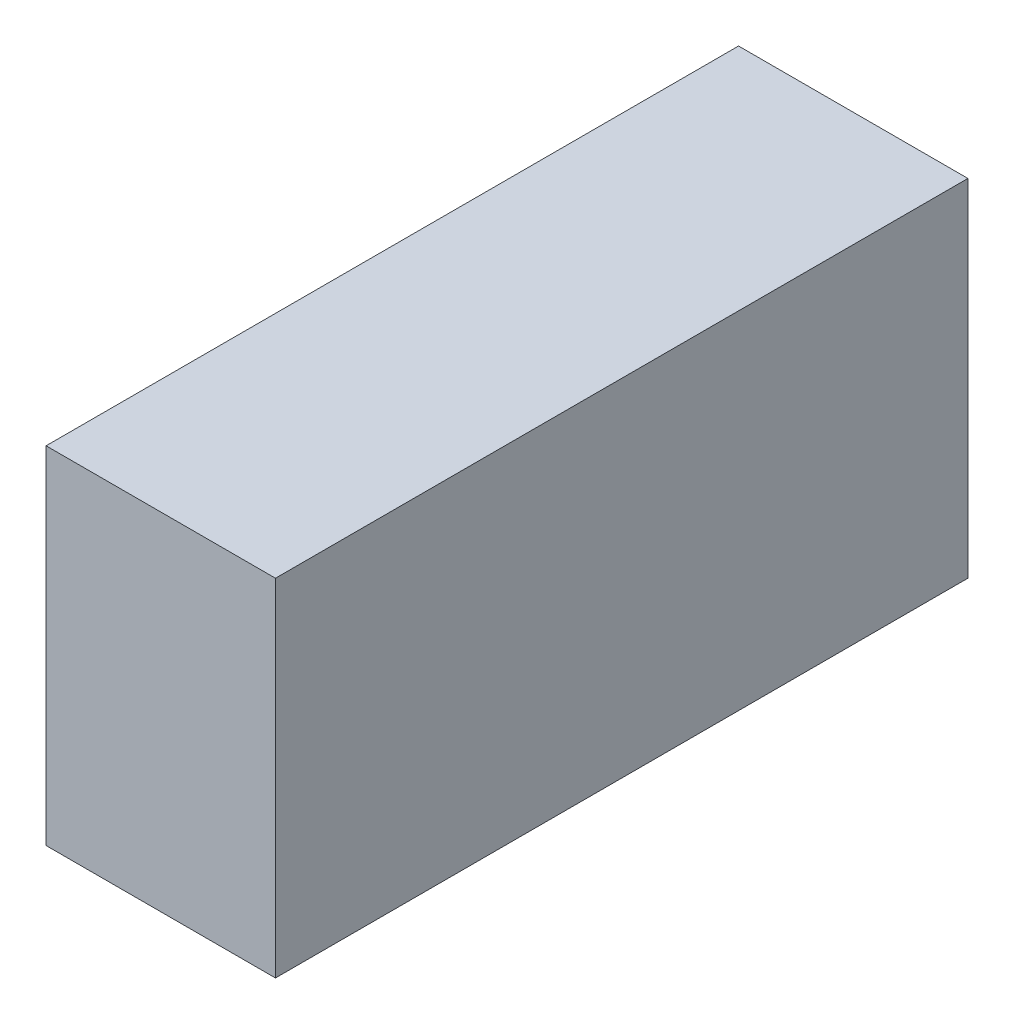
ISO-10303-21;
HEADER;
FILE_DESCRIPTION(('STEP AP214'),'2;1');
FILE_NAME('part.step','',(''),(''),'','','');
FILE_SCHEMA(('AUTOMOTIVE_DESIGN { 1 0 10303 214 1 1 1 1 }'));
ENDSEC;
DATA;
#1=APPLICATION_CONTEXT('core data for automotive mechanical design processes');
#2=APPLICATION_PROTOCOL_DEFINITION('international standard','automotive_design',2000,#1);
#3=PRODUCT_CONTEXT('',#1,'mechanical');
#4=PRODUCT('Part','Part','',(#3));
#5=PRODUCT_RELATED_PRODUCT_CATEGORY('part','',(#4));
#6=PRODUCT_DEFINITION_FORMATION('','',#4);
#7=PRODUCT_DEFINITION_CONTEXT('part definition',#1,'design');
#8=PRODUCT_DEFINITION('design','',#6,#7);
#9=PRODUCT_DEFINITION_SHAPE('','',#8);
#10=(LENGTH_UNIT() NAMED_UNIT(*) SI_UNIT(.MILLI.,.METRE.));
#11=(NAMED_UNIT(*) PLANE_ANGLE_UNIT() SI_UNIT($,.RADIAN.));
#12=(NAMED_UNIT(*) SI_UNIT($,.STERADIAN.) SOLID_ANGLE_UNIT());
#13=UNCERTAINTY_MEASURE_WITH_UNIT(LENGTH_MEASURE(1.E-05),#10,'distance_accuracy_value','');
#14=(GEOMETRIC_REPRESENTATION_CONTEXT(3) GLOBAL_UNCERTAINTY_ASSIGNED_CONTEXT((#13)) GLOBAL_UNIT_ASSIGNED_CONTEXT((#10,
#11,#12)) REPRESENTATION_CONTEXT('',''));
#15=CARTESIAN_POINT('',(0.,0.,0.));
#16=DIRECTION('',(0.,0.,1.));
#17=DIRECTION('',(1.,0.,0.));
#18=AXIS2_PLACEMENT_3D('',#15,#16,#17);
#19=CARTESIAN_POINT('',(0.26500074,-0.3999992,0.));
#20=DIRECTION('',(-1.,0.,0.));
#21=DIRECTION('',(0.,1.,0.));
#22=AXIS2_PLACEMENT_3D('',#19,#20,#21);
#23=PLANE('',#22);
#24=DIRECTION('',(0.,1.,0.));
#25=VECTOR('',#24,1.);
#26=CARTESIAN_POINT('',(0.26500074,-0.3999992,0.));
#27=LINE('',#26,#25);
#28=CARTESIAN_POINT('',(0.26500074,-0.3999992,0.));
#29=VERTEX_POINT('',#28);
#30=CARTESIAN_POINT('',(0.26500074,0.3999992,0.));
#31=VERTEX_POINT('',#30);
#32=EDGE_CURVE('E11',#29,#31,#27,.T.);
#33=ORIENTED_EDGE('',*,*,#32,.T.);
#34=DIRECTION('',(0.,0.,1.));
#35=VECTOR('',#34,1.);
#36=CARTESIAN_POINT('',(0.26500074,0.3999992,0.));
#37=LINE('',#36,#35);
#38=CARTESIAN_POINT('',(0.26500074,0.3999992,1.59999934));
#39=VERTEX_POINT('',#38);
#40=EDGE_CURVE('E24',#31,#39,#37,.T.);
#41=ORIENTED_EDGE('',*,*,#40,.T.);
#42=DIRECTION('',(0.,1.,0.));
#43=VECTOR('',#42,1.);
#44=CARTESIAN_POINT('',(0.26500074,-0.3999992,1.59999934));
#45=LINE('',#44,#43);
#46=CARTESIAN_POINT('',(0.26500074,-0.3999992,1.59999934));
#47=VERTEX_POINT('',#46);
#48=EDGE_CURVE('E87',#47,#39,#45,.T.);
#49=ORIENTED_EDGE('',*,*,#48,.F.);
#50=DIRECTION('',(0.,0.,1.));
#51=VECTOR('',#50,1.);
#52=CARTESIAN_POINT('',(0.26500074,-0.3999992,0.));
#53=LINE('',#52,#51);
#54=EDGE_CURVE('E36',#29,#47,#53,.T.);
#55=ORIENTED_EDGE('',*,*,#54,.F.);
#56=EDGE_LOOP('',(#33,#41,#49,#55));
#57=FACE_BOUND('',#56,.T.);
#58=ADVANCED_FACE('F17',(#57),#23,.F.);
#59=CARTESIAN_POINT('',(0.26500074,0.3999992,0.));
#60=DIRECTION('',(0.,-1.,0.));
#61=DIRECTION('',(-1.,0.,0.));
#62=AXIS2_PLACEMENT_3D('',#59,#60,#61);
#63=PLANE('',#62);
#64=DIRECTION('',(-1.,0.,0.));
#65=VECTOR('',#64,1.);
#66=CARTESIAN_POINT('',(0.26500074,0.3999992,0.));
#67=LINE('',#66,#65);
#68=CARTESIAN_POINT('',(-0.26500074,0.3999992,0.));
#69=VERTEX_POINT('',#68);
#70=EDGE_CURVE('E84',#31,#69,#67,.T.);
#71=ORIENTED_EDGE('',*,*,#70,.T.);
#72=DIRECTION('',(0.,0.,1.));
#73=VECTOR('',#72,1.);
#74=CARTESIAN_POINT('',(-0.26500074,0.3999992,0.));
#75=LINE('',#74,#73);
#76=CARTESIAN_POINT('',(-0.26500074,0.3999992,1.59999934));
#77=VERTEX_POINT('',#76);
#78=EDGE_CURVE('E82',#69,#77,#75,.T.);
#79=ORIENTED_EDGE('',*,*,#78,.T.);
#80=DIRECTION('',(-1.,0.,0.));
#81=VECTOR('',#80,1.);
#82=CARTESIAN_POINT('',(0.26500074,0.3999992,1.59999934));
#83=LINE('',#82,#81);
#84=EDGE_CURVE('E62',#39,#77,#83,.T.);
#85=ORIENTED_EDGE('',*,*,#84,.F.);
#86=ORIENTED_EDGE('',*,*,#40,.F.);
#87=EDGE_LOOP('',(#71,#79,#85,#86));
#88=FACE_BOUND('',#87,.T.);
#89=ADVANCED_FACE('F89',(#88),#63,.F.);
#90=CARTESIAN_POINT('',(-0.26500074,0.3999992,0.));
#91=DIRECTION('',(1.,0.,0.));
#92=DIRECTION('',(0.,-1.,0.));
#93=AXIS2_PLACEMENT_3D('',#90,#91,#92);
#94=PLANE('',#93);
#95=DIRECTION('',(0.,-1.,0.));
#96=VECTOR('',#95,1.);
#97=CARTESIAN_POINT('',(-0.26500074,0.3999992,0.));
#98=LINE('',#97,#96);
#99=CARTESIAN_POINT('',(-0.26500074,-0.3999992,0.));
#100=VERTEX_POINT('',#99);
#101=EDGE_CURVE('E71',#69,#100,#98,.T.);
#102=ORIENTED_EDGE('',*,*,#101,.T.);
#103=DIRECTION('',(0.,0.,1.));
#104=VECTOR('',#103,1.);
#105=CARTESIAN_POINT('',(-0.26500074,-0.3999992,0.));
#106=LINE('',#105,#104);
#107=CARTESIAN_POINT('',(-0.26500074,-0.3999992,1.59999934));
#108=VERTEX_POINT('',#107);
#109=EDGE_CURVE('E65',#100,#108,#106,.T.);
#110=ORIENTED_EDGE('',*,*,#109,.T.);
#111=DIRECTION('',(0.,-1.,0.));
#112=VECTOR('',#111,1.);
#113=CARTESIAN_POINT('',(-0.26500074,0.3999992,1.59999934));
#114=LINE('',#113,#112);
#115=EDGE_CURVE('E57',#77,#108,#114,.T.);
#116=ORIENTED_EDGE('',*,*,#115,.F.);
#117=ORIENTED_EDGE('',*,*,#78,.F.);
#118=EDGE_LOOP('',(#102,#110,#116,#117));
#119=FACE_BOUND('',#118,.T.);
#120=ADVANCED_FACE('F69',(#119),#94,.F.);
#121=CARTESIAN_POINT('',(-0.26500074,-0.3999992,0.));
#122=DIRECTION('',(0.,1.,0.));
#123=DIRECTION('',(1.,0.,0.));
#124=AXIS2_PLACEMENT_3D('',#121,#122,#123);
#125=PLANE('',#124);
#126=DIRECTION('',(1.,0.,0.));
#127=VECTOR('',#126,1.);
#128=CARTESIAN_POINT('',(-0.26500074,-0.3999992,0.));
#129=LINE('',#128,#127);
#130=EDGE_CURVE('E66',#100,#29,#129,.T.);
#131=ORIENTED_EDGE('',*,*,#130,.T.);
#132=ORIENTED_EDGE('',*,*,#54,.T.);
#133=DIRECTION('',(1.,0.,0.));
#134=VECTOR('',#133,1.);
#135=CARTESIAN_POINT('',(-0.26500074,-0.3999992,1.59999934));
#136=LINE('',#135,#134);
#137=EDGE_CURVE('E61',#108,#47,#136,.T.);
#138=ORIENTED_EDGE('',*,*,#137,.F.);
#139=ORIENTED_EDGE('',*,*,#109,.F.);
#140=EDGE_LOOP('',(#131,#132,#138,#139));
#141=FACE_BOUND('',#140,.T.);
#142=ADVANCED_FACE('F76',(#141),#125,.F.);
#143=CARTESIAN_POINT('',(0.,0.,0.));
#144=DIRECTION('',(0.,0.,1.));
#145=DIRECTION('',(1.,0.,0.));
#146=AXIS2_PLACEMENT_3D('',#143,#144,#145);
#147=PLANE('',#146);
#148=ORIENTED_EDGE('',*,*,#130,.F.);
#149=ORIENTED_EDGE('',*,*,#101,.F.);
#150=ORIENTED_EDGE('',*,*,#70,.F.);
#151=ORIENTED_EDGE('',*,*,#32,.F.);
#152=EDGE_LOOP('',(#148,#149,#150,#151));
#153=FACE_BOUND('',#152,.T.);
#154=ADVANCED_FACE('F91',(#153),#147,.F.);
#155=CARTESIAN_POINT('',(0.,0.,1.59999934));
#156=DIRECTION('',(0.,0.,1.));
#157=DIRECTION('',(1.,0.,0.));
#158=AXIS2_PLACEMENT_3D('',#155,#156,#157);
#159=PLANE('',#158);
#160=ORIENTED_EDGE('',*,*,#48,.T.);
#161=ORIENTED_EDGE('',*,*,#84,.T.);
#162=ORIENTED_EDGE('',*,*,#115,.T.);
#163=ORIENTED_EDGE('',*,*,#137,.T.);
#164=EDGE_LOOP('',(#160,#161,#162,#163));
#165=FACE_BOUND('',#164,.T.);
#166=ADVANCED_FACE('F59',(#165),#159,.T.);
#167=CLOSED_SHELL('',(#58,#89,#120,#142,#154,#166));
#168=MANIFOLD_SOLID_BREP('B1',#167);
#169=ADVANCED_BREP_SHAPE_REPRESENTATION('',(#18,#168),#14);
#170=SHAPE_DEFINITION_REPRESENTATION(#9,#169);
ENDSEC;
END-ISO-10303-21;
